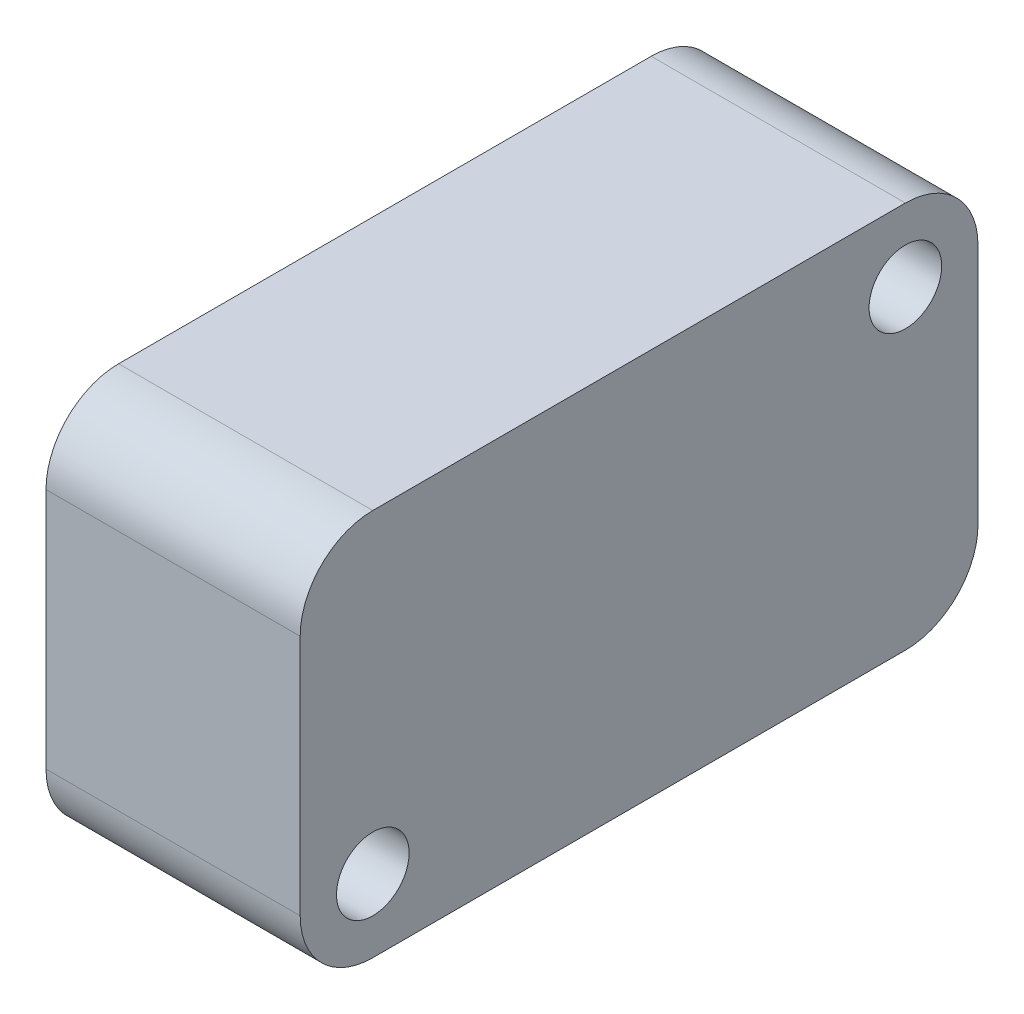
ISO-10303-21;
HEADER;
FILE_DESCRIPTION(('STEP AP214'),'2;1');
FILE_NAME('part.step','',(''),(''),'','','');
FILE_SCHEMA(('AUTOMOTIVE_DESIGN { 1 0 10303 214 1 1 1 1 }'));
ENDSEC;
DATA;
#1=APPLICATION_CONTEXT('core data for automotive mechanical design processes');
#2=APPLICATION_PROTOCOL_DEFINITION('international standard','automotive_design',2000,#1);
#3=PRODUCT_CONTEXT('',#1,'mechanical');
#4=PRODUCT('Part','Part','',(#3));
#5=PRODUCT_RELATED_PRODUCT_CATEGORY('part','',(#4));
#6=PRODUCT_DEFINITION_FORMATION('','',#4);
#7=PRODUCT_DEFINITION_CONTEXT('part definition',#1,'design');
#8=PRODUCT_DEFINITION('design','',#6,#7);
#9=PRODUCT_DEFINITION_SHAPE('','',#8);
#10=(LENGTH_UNIT() NAMED_UNIT(*) SI_UNIT(.MILLI.,.METRE.));
#11=(NAMED_UNIT(*) PLANE_ANGLE_UNIT() SI_UNIT($,.RADIAN.));
#12=(NAMED_UNIT(*) SI_UNIT($,.STERADIAN.) SOLID_ANGLE_UNIT());
#13=UNCERTAINTY_MEASURE_WITH_UNIT(LENGTH_MEASURE(1.E-05),#10,'distance_accuracy_value','');
#14=(GEOMETRIC_REPRESENTATION_CONTEXT(3) GLOBAL_UNCERTAINTY_ASSIGNED_CONTEXT((#13)) GLOBAL_UNIT_ASSIGNED_CONTEXT((#10,
#11,#12)) REPRESENTATION_CONTEXT('',''));
#15=CARTESIAN_POINT('',(0.,0.,0.));
#16=DIRECTION('',(0.,0.,1.));
#17=DIRECTION('',(1.,0.,0.));
#18=AXIS2_PLACEMENT_3D('',#15,#16,#17);
#19=CARTESIAN_POINT('',(10.5,-8.,14.));
#20=DIRECTION('',(0.,1.,0.));
#21=DIRECTION('',(0.,0.,1.));
#22=AXIS2_PLACEMENT_3D('',#19,#20,#21);
#23=PLANE('',#22);
#24=DIRECTION('',(0.,0.,-1.));
#25=VECTOR('',#24,1.);
#26=CARTESIAN_POINT('',(0.,-8.,14.));
#27=LINE('',#26,#25);
#28=CARTESIAN_POINT('',(0.,-8.,11.));
#29=VERTEX_POINT('',#28);
#30=CARTESIAN_POINT('',(0.,-8.,-11.));
#31=VERTEX_POINT('',#30);
#32=EDGE_CURVE('E183',#29,#31,#27,.T.);
#33=ORIENTED_EDGE('',*,*,#32,.T.);
#34=DIRECTION('',(-1.,0.,0.));
#35=VECTOR('',#34,1.);
#36=CARTESIAN_POINT('',(10.5,-8.,-11.));
#37=LINE('',#36,#35);
#38=CARTESIAN_POINT('',(10.5,-8.,-11.));
#39=VERTEX_POINT('',#38);
#40=EDGE_CURVE('E218',#31,#39,#37,.F.);
#41=ORIENTED_EDGE('',*,*,#40,.T.);
#42=DIRECTION('',(0.,0.,-1.));
#43=VECTOR('',#42,1.);
#44=CARTESIAN_POINT('',(10.5,-8.,14.));
#45=LINE('',#44,#43);
#46=CARTESIAN_POINT('',(10.5,-8.,11.));
#47=VERTEX_POINT('',#46);
#48=EDGE_CURVE('E189',#47,#39,#45,.T.);
#49=ORIENTED_EDGE('',*,*,#48,.F.);
#50=DIRECTION('',(-1.,0.,0.));
#51=VECTOR('',#50,1.);
#52=CARTESIAN_POINT('',(10.5,-8.,11.));
#53=LINE('',#52,#51);
#54=EDGE_CURVE('E215',#47,#29,#53,.T.);
#55=ORIENTED_EDGE('',*,*,#54,.T.);
#56=EDGE_LOOP('',(#33,#41,#49,#55));
#57=FACE_BOUND('',#56,.T.);
#58=DIRECTION('',(0.,0.,-1.));
#59=VECTOR('',#58,1.);
#60=CARTESIAN_POINT('',(3.,-8.,-8.));
#61=LINE('',#60,#59);
#62=CARTESIAN_POINT('',(3.,-8.,-8.));
#63=VERTEX_POINT('',#62);
#64=CARTESIAN_POINT('',(3.,-8.,-10.5));
#65=VERTEX_POINT('',#64);
#66=EDGE_CURVE('E135',#63,#65,#61,.T.);
#67=ORIENTED_EDGE('',*,*,#66,.F.);
#68=DIRECTION('',(-1.,0.,0.));
#69=VECTOR('',#68,1.);
#70=CARTESIAN_POINT('',(3.,-8.,-8.));
#71=LINE('',#70,#69);
#72=CARTESIAN_POINT('',(7.5,-8.,-8.));
#73=VERTEX_POINT('',#72);
#74=EDGE_CURVE('E146',#73,#63,#71,.T.);
#75=ORIENTED_EDGE('',*,*,#74,.F.);
#76=DIRECTION('',(0.,0.,1.));
#77=VECTOR('',#76,1.);
#78=CARTESIAN_POINT('',(7.5,-8.,-8.));
#79=LINE('',#78,#77);
#80=CARTESIAN_POINT('',(7.5,-8.,-10.5));
#81=VERTEX_POINT('',#80);
#82=EDGE_CURVE('E154',#81,#73,#79,.T.);
#83=ORIENTED_EDGE('',*,*,#82,.F.);
#84=DIRECTION('',(1.,0.,0.));
#85=VECTOR('',#84,1.);
#86=CARTESIAN_POINT('',(3.,-8.,-10.5));
#87=LINE('',#86,#85);
#88=EDGE_CURVE('E149',#65,#81,#87,.T.);
#89=ORIENTED_EDGE('',*,*,#88,.F.);
#90=EDGE_LOOP('',(#67,#75,#83,#89));
#91=FACE_BOUND('',#90,.T.);
#92=ADVANCED_FACE('F33',(#57,#91),#23,.F.);
#93=CARTESIAN_POINT('',(10.5,8.,-14.));
#94=DIRECTION('',(0.,0.,1.));
#95=DIRECTION('',(0.,-1.,0.));
#96=AXIS2_PLACEMENT_3D('',#93,#94,#95);
#97=PLANE('',#96);
#98=DIRECTION('',(0.,1.,0.));
#99=VECTOR('',#98,1.);
#100=CARTESIAN_POINT('',(10.5,8.,-14.));
#101=LINE('',#100,#99);
#102=CARTESIAN_POINT('',(10.5,-5.,-14.));
#103=VERTEX_POINT('',#102);
#104=CARTESIAN_POINT('',(10.5,5.,-14.));
#105=VERTEX_POINT('',#104);
#106=EDGE_CURVE('E179',#103,#105,#101,.T.);
#107=ORIENTED_EDGE('',*,*,#106,.F.);
#108=DIRECTION('',(-1.,0.,0.));
#109=VECTOR('',#108,1.);
#110=CARTESIAN_POINT('',(10.5,-5.,-14.));
#111=LINE('',#110,#109);
#112=CARTESIAN_POINT('',(0.,-5.,-14.));
#113=VERTEX_POINT('',#112);
#114=EDGE_CURVE('E204',#103,#113,#111,.T.);
#115=ORIENTED_EDGE('',*,*,#114,.T.);
#116=DIRECTION('',(0.,1.,0.));
#117=VECTOR('',#116,1.);
#118=CARTESIAN_POINT('',(0.,8.,-14.));
#119=LINE('',#118,#117);
#120=CARTESIAN_POINT('',(0.,5.,-14.));
#121=VERTEX_POINT('',#120);
#122=EDGE_CURVE('E176',#113,#121,#119,.T.);
#123=ORIENTED_EDGE('',*,*,#122,.T.);
#124=DIRECTION('',(-1.,0.,0.));
#125=VECTOR('',#124,1.);
#126=CARTESIAN_POINT('',(10.5,5.,-14.));
#127=LINE('',#126,#125);
#128=EDGE_CURVE('E192',#121,#105,#127,.F.);
#129=ORIENTED_EDGE('',*,*,#128,.T.);
#130=EDGE_LOOP('',(#107,#115,#123,#129));
#131=FACE_BOUND('',#130,.T.);
#132=ADVANCED_FACE('F269',(#131),#97,.F.);
#133=CARTESIAN_POINT('',(10.5,8.,14.));
#134=DIRECTION('',(0.,-1.,0.));
#135=DIRECTION('',(0.,0.,-1.));
#136=AXIS2_PLACEMENT_3D('',#133,#134,#135);
#137=PLANE('',#136);
#138=DIRECTION('',(0.,0.,1.));
#139=VECTOR('',#138,1.);
#140=CARTESIAN_POINT('',(10.5,8.,14.));
#141=LINE('',#140,#139);
#142=CARTESIAN_POINT('',(10.5,8.,-11.));
#143=VERTEX_POINT('',#142);
#144=CARTESIAN_POINT('',(10.5,8.,11.));
#145=VERTEX_POINT('',#144);
#146=EDGE_CURVE('E182',#143,#145,#141,.T.);
#147=ORIENTED_EDGE('',*,*,#146,.F.);
#148=DIRECTION('',(-1.,0.,0.));
#149=VECTOR('',#148,1.);
#150=CARTESIAN_POINT('',(10.5,8.,-11.));
#151=LINE('',#150,#149);
#152=CARTESIAN_POINT('',(0.,8.,-11.));
#153=VERTEX_POINT('',#152);
#154=EDGE_CURVE('E230',#143,#153,#151,.T.);
#155=ORIENTED_EDGE('',*,*,#154,.T.);
#156=DIRECTION('',(0.,0.,1.));
#157=VECTOR('',#156,1.);
#158=CARTESIAN_POINT('',(0.,8.,14.));
#159=LINE('',#158,#157);
#160=CARTESIAN_POINT('',(0.,8.,11.));
#161=VERTEX_POINT('',#160);
#162=EDGE_CURVE('E195',#153,#161,#159,.T.);
#163=ORIENTED_EDGE('',*,*,#162,.T.);
#164=DIRECTION('',(-1.,0.,0.));
#165=VECTOR('',#164,1.);
#166=CARTESIAN_POINT('',(10.5,8.,11.));
#167=LINE('',#166,#165);
#168=EDGE_CURVE('E228',#161,#145,#167,.F.);
#169=ORIENTED_EDGE('',*,*,#168,.T.);
#170=EDGE_LOOP('',(#147,#155,#163,#169));
#171=FACE_BOUND('',#170,.T.);
#172=ADVANCED_FACE('F275',(#171),#137,.F.);
#173=CARTESIAN_POINT('',(10.5,8.,14.));
#174=DIRECTION('',(0.,0.,-1.));
#175=DIRECTION('',(0.,1.,0.));
#176=AXIS2_PLACEMENT_3D('',#173,#174,#175);
#177=PLANE('',#176);
#178=DIRECTION('',(0.,-1.,0.));
#179=VECTOR('',#178,1.);
#180=CARTESIAN_POINT('',(10.5,8.,14.));
#181=LINE('',#180,#179);
#182=CARTESIAN_POINT('',(10.5,5.,14.));
#183=VERTEX_POINT('',#182);
#184=CARTESIAN_POINT('',(10.5,-5.,14.));
#185=VERTEX_POINT('',#184);
#186=EDGE_CURVE('E186',#183,#185,#181,.T.);
#187=ORIENTED_EDGE('',*,*,#186,.F.);
#188=DIRECTION('',(-1.,0.,0.));
#189=VECTOR('',#188,1.);
#190=CARTESIAN_POINT('',(10.5,5.,14.));
#191=LINE('',#190,#189);
#192=CARTESIAN_POINT('',(0.,5.,14.));
#193=VERTEX_POINT('',#192);
#194=EDGE_CURVE('E235',#183,#193,#191,.T.);
#195=ORIENTED_EDGE('',*,*,#194,.T.);
#196=DIRECTION('',(0.,-1.,0.));
#197=VECTOR('',#196,1.);
#198=CARTESIAN_POINT('',(0.,8.,14.));
#199=LINE('',#198,#197);
#200=CARTESIAN_POINT('',(0.,-5.,14.));
#201=VERTEX_POINT('',#200);
#202=EDGE_CURVE('E198',#193,#201,#199,.T.);
#203=ORIENTED_EDGE('',*,*,#202,.T.);
#204=DIRECTION('',(-1.,0.,0.));
#205=VECTOR('',#204,1.);
#206=CARTESIAN_POINT('',(10.5,-5.,14.));
#207=LINE('',#206,#205);
#208=EDGE_CURVE('E233',#201,#185,#207,.F.);
#209=ORIENTED_EDGE('',*,*,#208,.T.);
#210=EDGE_LOOP('',(#187,#195,#203,#209));
#211=FACE_BOUND('',#210,.T.);
#212=ADVANCED_FACE('F282',(#211),#177,.F.);
#213=CARTESIAN_POINT('',(10.5,0.,0.));
#214=DIRECTION('',(1.,0.,0.));
#215=DIRECTION('',(0.,0.,-1.));
#216=AXIS2_PLACEMENT_3D('',#213,#214,#215);
#217=PLANE('',#216);
#218=CARTESIAN_POINT('',(10.5,-5.,11.));
#219=DIRECTION('',(1.,0.,0.));
#220=DIRECTION('',(0.,0.,-1.));
#221=AXIS2_PLACEMENT_3D('',#218,#219,#220);
#222=CIRCLE('',#221,1.5);
#223=CARTESIAN_POINT('',(10.5,-5.,9.5));
#224=VERTEX_POINT('',#223);
#225=EDGE_CURVE('E166',#224,#224,#222,.T.);
#226=ORIENTED_EDGE('',*,*,#225,.F.);
#227=EDGE_LOOP('',(#226));
#228=FACE_BOUND('',#227,.T.);
#229=CARTESIAN_POINT('',(10.5,5.,-11.));
#230=DIRECTION('',(1.,0.,0.));
#231=DIRECTION('',(0.,0.,-1.));
#232=AXIS2_PLACEMENT_3D('',#229,#230,#231);
#233=CIRCLE('',#232,1.5);
#234=CARTESIAN_POINT('',(10.5,5.,-12.5));
#235=VERTEX_POINT('',#234);
#236=EDGE_CURVE('E170',#235,#235,#233,.T.);
#237=ORIENTED_EDGE('',*,*,#236,.F.);
#238=EDGE_LOOP('',(#237));
#239=FACE_BOUND('',#238,.T.);
#240=ORIENTED_EDGE('',*,*,#48,.T.);
#241=CARTESIAN_POINT('',(10.5,-5.,-11.));
#242=DIRECTION('',(1.,0.,0.));
#243=DIRECTION('',(0.,0.,-1.));
#244=AXIS2_PLACEMENT_3D('',#241,#242,#243);
#245=CIRCLE('',#244,3.);
#246=EDGE_CURVE('E226',#39,#103,#245,.T.);
#247=ORIENTED_EDGE('',*,*,#246,.T.);
#248=ORIENTED_EDGE('',*,*,#106,.T.);
#249=CARTESIAN_POINT('',(10.5,5.,-11.));
#250=DIRECTION('',(1.,0.,0.));
#251=DIRECTION('',(0.,0.,-1.));
#252=AXIS2_PLACEMENT_3D('',#249,#250,#251);
#253=CIRCLE('',#252,3.);
#254=EDGE_CURVE('E224',#105,#143,#253,.T.);
#255=ORIENTED_EDGE('',*,*,#254,.T.);
#256=ORIENTED_EDGE('',*,*,#146,.T.);
#257=CARTESIAN_POINT('',(10.5,5.,11.));
#258=DIRECTION('',(1.,0.,0.));
#259=DIRECTION('',(0.,0.,-1.));
#260=AXIS2_PLACEMENT_3D('',#257,#258,#259);
#261=CIRCLE('',#260,3.);
#262=EDGE_CURVE('E222',#145,#183,#261,.T.);
#263=ORIENTED_EDGE('',*,*,#262,.T.);
#264=ORIENTED_EDGE('',*,*,#186,.T.);
#265=CARTESIAN_POINT('',(10.5,-5.,11.));
#266=DIRECTION('',(1.,0.,0.));
#267=DIRECTION('',(0.,0.,-1.));
#268=AXIS2_PLACEMENT_3D('',#265,#266,#267);
#269=CIRCLE('',#268,3.);
#270=EDGE_CURVE('E220',#185,#47,#269,.T.);
#271=ORIENTED_EDGE('',*,*,#270,.T.);
#272=EDGE_LOOP('',(#240,#247,#248,#255,#256,#263,#264,#271));
#273=FACE_BOUND('',#272,.T.);
#274=ADVANCED_FACE('F285',(#228,#239,#273),#217,.T.);
#275=CARTESIAN_POINT('',(0.,0.,0.));
#276=DIRECTION('',(1.,0.,0.));
#277=DIRECTION('',(0.,0.,-1.));
#278=AXIS2_PLACEMENT_3D('',#275,#276,#277);
#279=PLANE('',#278);
#280=CARTESIAN_POINT('',(0.,-5.,11.));
#281=DIRECTION('',(1.,0.,0.));
#282=DIRECTION('',(0.,0.,-1.));
#283=AXIS2_PLACEMENT_3D('',#280,#281,#282);
#284=CIRCLE('',#283,1.5);
#285=CARTESIAN_POINT('',(0.,-5.,9.5));
#286=VERTEX_POINT('',#285);
#287=EDGE_CURVE('E167',#286,#286,#284,.T.);
#288=ORIENTED_EDGE('',*,*,#287,.T.);
#289=EDGE_LOOP('',(#288));
#290=FACE_BOUND('',#289,.T.);
#291=CARTESIAN_POINT('',(0.,5.,-11.));
#292=DIRECTION('',(1.,0.,0.));
#293=DIRECTION('',(0.,0.,-1.));
#294=AXIS2_PLACEMENT_3D('',#291,#292,#293);
#295=CIRCLE('',#294,1.5);
#296=CARTESIAN_POINT('',(0.,5.,-12.5));
#297=VERTEX_POINT('',#296);
#298=EDGE_CURVE('E173',#297,#297,#295,.T.);
#299=ORIENTED_EDGE('',*,*,#298,.T.);
#300=EDGE_LOOP('',(#299));
#301=FACE_BOUND('',#300,.T.);
#302=ORIENTED_EDGE('',*,*,#122,.F.);
#303=CARTESIAN_POINT('',(0.,-5.,-11.));
#304=DIRECTION('',(1.,0.,0.));
#305=DIRECTION('',(0.,0.,-1.));
#306=AXIS2_PLACEMENT_3D('',#303,#304,#305);
#307=CIRCLE('',#306,3.);
#308=EDGE_CURVE('E213',#113,#31,#307,.F.);
#309=ORIENTED_EDGE('',*,*,#308,.T.);
#310=ORIENTED_EDGE('',*,*,#32,.F.);
#311=CARTESIAN_POINT('',(0.,-5.,11.));
#312=DIRECTION('',(1.,0.,0.));
#313=DIRECTION('',(0.,0.,-1.));
#314=AXIS2_PLACEMENT_3D('',#311,#312,#313);
#315=CIRCLE('',#314,3.);
#316=EDGE_CURVE('E207',#29,#201,#315,.F.);
#317=ORIENTED_EDGE('',*,*,#316,.T.);
#318=ORIENTED_EDGE('',*,*,#202,.F.);
#319=CARTESIAN_POINT('',(0.,5.,11.));
#320=DIRECTION('',(1.,0.,0.));
#321=DIRECTION('',(0.,0.,-1.));
#322=AXIS2_PLACEMENT_3D('',#319,#320,#321);
#323=CIRCLE('',#322,3.);
#324=EDGE_CURVE('E209',#193,#161,#323,.F.);
#325=ORIENTED_EDGE('',*,*,#324,.T.);
#326=ORIENTED_EDGE('',*,*,#162,.F.);
#327=CARTESIAN_POINT('',(0.,5.,-11.));
#328=DIRECTION('',(1.,0.,0.));
#329=DIRECTION('',(0.,0.,-1.));
#330=AXIS2_PLACEMENT_3D('',#327,#328,#329);
#331=CIRCLE('',#330,3.);
#332=EDGE_CURVE('E211',#153,#121,#331,.F.);
#333=ORIENTED_EDGE('',*,*,#332,.T.);
#334=EDGE_LOOP('',(#302,#309,#310,#317,#318,#325,#326,#333));
#335=FACE_BOUND('',#334,.T.);
#336=ADVANCED_FACE('F280',(#290,#301,#335),#279,.F.);
#337=CARTESIAN_POINT('',(0.,5.,-11.));
#338=DIRECTION('',(1.,0.,0.));
#339=DIRECTION('',(0.,0.,-1.));
#340=AXIS2_PLACEMENT_3D('',#337,#338,#339);
#341=CYLINDRICAL_SURFACE('',#340,1.5);
#342=CARTESIAN_POINT('',(0.,5.,-12.5));
#343=CARTESIAN_POINT('',(0.109375,5.,-12.5));
#344=CARTESIAN_POINT('',(0.21875,5.,-12.5));
#345=CARTESIAN_POINT('',(0.4375,5.,-12.5));
#346=CARTESIAN_POINT('',(0.546875,5.,-12.5));
#347=CARTESIAN_POINT('',(0.765625,5.,-12.5));
#348=CARTESIAN_POINT('',(0.875,5.,-12.5));
#349=CARTESIAN_POINT('',(1.09375,5.,-12.5));
#350=CARTESIAN_POINT('',(1.203125,5.,-12.5));
#351=CARTESIAN_POINT('',(1.421875,5.,-12.5));
#352=CARTESIAN_POINT('',(1.53125,5.,-12.5));
#353=CARTESIAN_POINT('',(1.75,5.,-12.5));
#354=CARTESIAN_POINT('',(1.859375,5.,-12.5));
#355=CARTESIAN_POINT('',(2.078125,5.,-12.5));
#356=CARTESIAN_POINT('',(2.1875,5.,-12.5));
#357=CARTESIAN_POINT('',(2.40625,5.,-12.5));
#358=CARTESIAN_POINT('',(2.515625,5.,-12.5));
#359=CARTESIAN_POINT('',(2.734375,5.,-12.5));
#360=CARTESIAN_POINT('',(2.84375,5.,-12.5));
#361=CARTESIAN_POINT('',(3.0625,5.,-12.5));
#362=CARTESIAN_POINT('',(3.171875,5.,-12.5));
#363=CARTESIAN_POINT('',(3.390625,5.,-12.5));
#364=CARTESIAN_POINT('',(3.5,5.,-12.5));
#365=CARTESIAN_POINT('',(3.71875,5.,-12.5));
#366=CARTESIAN_POINT('',(3.828125,5.,-12.5));
#367=CARTESIAN_POINT('',(4.046875,5.,-12.5));
#368=CARTESIAN_POINT('',(4.15625,5.,-12.5));
#369=CARTESIAN_POINT('',(4.375,5.,-12.5));
#370=CARTESIAN_POINT('',(4.484375,5.,-12.5));
#371=CARTESIAN_POINT('',(4.703125,5.,-12.5));
#372=CARTESIAN_POINT('',(4.8125,5.,-12.5));
#373=CARTESIAN_POINT('',(5.03125,5.,-12.5));
#374=CARTESIAN_POINT('',(5.140625,5.,-12.5));
#375=CARTESIAN_POINT('',(5.359375,5.,-12.5));
#376=CARTESIAN_POINT('',(5.46875,5.,-12.5));
#377=CARTESIAN_POINT('',(5.6875,5.,-12.5));
#378=CARTESIAN_POINT('',(5.796875,5.,-12.5));
#379=CARTESIAN_POINT('',(6.015625,5.,-12.5));
#380=CARTESIAN_POINT('',(6.125,5.,-12.5));
#381=CARTESIAN_POINT('',(6.34375,5.,-12.5));
#382=CARTESIAN_POINT('',(6.453125,5.,-12.5));
#383=CARTESIAN_POINT('',(6.671875,5.,-12.5));
#384=CARTESIAN_POINT('',(6.78125,5.,-12.5));
#385=CARTESIAN_POINT('',(7.,5.,-12.5));
#386=CARTESIAN_POINT('',(7.109375,5.,-12.5));
#387=CARTESIAN_POINT('',(7.328125,5.,-12.5));
#388=CARTESIAN_POINT('',(7.4375,5.,-12.5));
#389=CARTESIAN_POINT('',(7.65625,5.,-12.5));
#390=CARTESIAN_POINT('',(7.765625,5.,-12.5));
#391=CARTESIAN_POINT('',(7.984375,5.,-12.5));
#392=CARTESIAN_POINT('',(8.09375,5.,-12.5));
#393=CARTESIAN_POINT('',(8.3125,5.,-12.5));
#394=CARTESIAN_POINT('',(8.421875,5.,-12.5));
#395=CARTESIAN_POINT('',(8.640625,5.,-12.5));
#396=CARTESIAN_POINT('',(8.75,5.,-12.5));
#397=CARTESIAN_POINT('',(8.96875,5.,-12.5));
#398=CARTESIAN_POINT('',(9.078125,5.,-12.5));
#399=CARTESIAN_POINT('',(9.296875,5.,-12.5));
#400=CARTESIAN_POINT('',(9.40625,5.,-12.5));
#401=CARTESIAN_POINT('',(9.625,5.,-12.5));
#402=CARTESIAN_POINT('',(9.734375,5.,-12.5));
#403=CARTESIAN_POINT('',(9.953125,5.,-12.5));
#404=CARTESIAN_POINT('',(10.0625,5.,-12.5));
#405=CARTESIAN_POINT('',(10.28125,5.,-12.5));
#406=CARTESIAN_POINT('',(10.390625,5.,-12.5));
#407=CARTESIAN_POINT('',(10.5,5.,-12.5));
#408=B_SPLINE_CURVE_WITH_KNOTS('',3,(#342,#343,#344,#345,#346,#347,#348,#349,#350,#351,#352,
#353,#354,#355,#356,#357,#358,#359,#360,#361,#362,#363,#364,#365,#366,#367,#368,#369,#370,#371,
#372,#373,#374,#375,#376,#377,#378,#379,#380,#381,#382,#383,#384,#385,#386,#387,#388,#389,#390,
#391,#392,#393,#394,#395,#396,#397,#398,#399,#400,#401,#402,#403,#404,#405,#406,#407),
.UNSPECIFIED.,.F.,.F.,(4,2,2,2,2,2,2,2,2,2,2,2,2,2,2,2,2,2,2,2,2,2,2,2,2,2,2,2,2,2,2,2,4),(0.,
0.328125,0.65625,0.984375,1.3125,1.640625,1.96875,2.296875,2.625,2.953125,3.28125,3.609375,
3.9375,4.265625,4.59375,4.921875,5.25,5.578125,5.90625,6.234375,6.5625,6.890625,7.21875,
7.546875,7.875,8.203125,8.53125,8.859375,9.1875,9.515625,9.84375,10.171875,10.5),.UNSPECIFIED.);
#409=EDGE_CURVE('BSEAM333',#297,#235,#408,.T.);
#410=ORIENTED_EDGE('',*,*,#298,.F.);
#411=ORIENTED_EDGE('',*,*,#236,.T.);
#412=ORIENTED_EDGE('',*,*,#409,.T.);
#413=ORIENTED_EDGE('',*,*,#409,.F.);
#414=EDGE_LOOP('',(#410,#412,#411,#413));
#415=FACE_BOUND('',#414,.T.);
#416=ADVANCED_FACE('F333',(#415),#341,.F.);
#417=CARTESIAN_POINT('',(0.,-5.,11.));
#418=DIRECTION('',(1.,0.,0.));
#419=DIRECTION('',(0.,0.,-1.));
#420=AXIS2_PLACEMENT_3D('',#417,#418,#419);
#421=CYLINDRICAL_SURFACE('',#420,1.5);
#422=CARTESIAN_POINT('',(0.,-5.,9.5));
#423=CARTESIAN_POINT('',(0.109375,-5.,9.5));
#424=CARTESIAN_POINT('',(0.21875,-5.,9.5));
#425=CARTESIAN_POINT('',(0.4375,-5.,9.5));
#426=CARTESIAN_POINT('',(0.546875,-5.,9.5));
#427=CARTESIAN_POINT('',(0.765625,-5.,9.5));
#428=CARTESIAN_POINT('',(0.875,-5.,9.5));
#429=CARTESIAN_POINT('',(1.09375,-5.,9.5));
#430=CARTESIAN_POINT('',(1.203125,-5.,9.5));
#431=CARTESIAN_POINT('',(1.421875,-5.,9.5));
#432=CARTESIAN_POINT('',(1.53125,-5.,9.5));
#433=CARTESIAN_POINT('',(1.75,-5.,9.5));
#434=CARTESIAN_POINT('',(1.859375,-5.,9.5));
#435=CARTESIAN_POINT('',(2.078125,-5.,9.5));
#436=CARTESIAN_POINT('',(2.1875,-5.,9.5));
#437=CARTESIAN_POINT('',(2.40625,-5.,9.5));
#438=CARTESIAN_POINT('',(2.515625,-5.,9.5));
#439=CARTESIAN_POINT('',(2.734375,-5.,9.5));
#440=CARTESIAN_POINT('',(2.84375,-5.,9.5));
#441=CARTESIAN_POINT('',(3.0625,-5.,9.5));
#442=CARTESIAN_POINT('',(3.171875,-5.,9.5));
#443=CARTESIAN_POINT('',(3.390625,-5.,9.5));
#444=CARTESIAN_POINT('',(3.5,-5.,9.5));
#445=CARTESIAN_POINT('',(3.71875,-5.,9.5));
#446=CARTESIAN_POINT('',(3.828125,-5.,9.5));
#447=CARTESIAN_POINT('',(4.046875,-5.,9.5));
#448=CARTESIAN_POINT('',(4.15625,-5.,9.5));
#449=CARTESIAN_POINT('',(4.375,-5.,9.5));
#450=CARTESIAN_POINT('',(4.484375,-5.,9.5));
#451=CARTESIAN_POINT('',(4.703125,-5.,9.5));
#452=CARTESIAN_POINT('',(4.8125,-5.,9.5));
#453=CARTESIAN_POINT('',(5.03125,-5.,9.5));
#454=CARTESIAN_POINT('',(5.140625,-5.,9.5));
#455=CARTESIAN_POINT('',(5.359375,-5.,9.5));
#456=CARTESIAN_POINT('',(5.46875,-5.,9.5));
#457=CARTESIAN_POINT('',(5.6875,-5.,9.5));
#458=CARTESIAN_POINT('',(5.796875,-5.,9.5));
#459=CARTESIAN_POINT('',(6.015625,-5.,9.5));
#460=CARTESIAN_POINT('',(6.125,-5.,9.5));
#461=CARTESIAN_POINT('',(6.34375,-5.,9.5));
#462=CARTESIAN_POINT('',(6.453125,-5.,9.5));
#463=CARTESIAN_POINT('',(6.671875,-5.,9.5));
#464=CARTESIAN_POINT('',(6.78125,-5.,9.5));
#465=CARTESIAN_POINT('',(7.,-5.,9.5));
#466=CARTESIAN_POINT('',(7.109375,-5.,9.5));
#467=CARTESIAN_POINT('',(7.328125,-5.,9.5));
#468=CARTESIAN_POINT('',(7.4375,-5.,9.5));
#469=CARTESIAN_POINT('',(7.65625,-5.,9.5));
#470=CARTESIAN_POINT('',(7.765625,-5.,9.5));
#471=CARTESIAN_POINT('',(7.984375,-5.,9.5));
#472=CARTESIAN_POINT('',(8.09375,-5.,9.5));
#473=CARTESIAN_POINT('',(8.3125,-5.,9.5));
#474=CARTESIAN_POINT('',(8.421875,-5.,9.5));
#475=CARTESIAN_POINT('',(8.640625,-5.,9.5));
#476=CARTESIAN_POINT('',(8.75,-5.,9.5));
#477=CARTESIAN_POINT('',(8.96875,-5.,9.5));
#478=CARTESIAN_POINT('',(9.078125,-5.,9.5));
#479=CARTESIAN_POINT('',(9.296875,-5.,9.5));
#480=CARTESIAN_POINT('',(9.40625,-5.,9.5));
#481=CARTESIAN_POINT('',(9.625,-5.,9.5));
#482=CARTESIAN_POINT('',(9.734375,-5.,9.5));
#483=CARTESIAN_POINT('',(9.953125,-5.,9.5));
#484=CARTESIAN_POINT('',(10.0625,-5.,9.5));
#485=CARTESIAN_POINT('',(10.28125,-5.,9.5));
#486=CARTESIAN_POINT('',(10.390625,-5.,9.5));
#487=CARTESIAN_POINT('',(10.5,-5.,9.5));
#488=B_SPLINE_CURVE_WITH_KNOTS('',3,(#422,#423,#424,#425,#426,#427,#428,#429,#430,#431,#432,
#433,#434,#435,#436,#437,#438,#439,#440,#441,#442,#443,#444,#445,#446,#447,#448,#449,#450,#451,
#452,#453,#454,#455,#456,#457,#458,#459,#460,#461,#462,#463,#464,#465,#466,#467,#468,#469,#470,
#471,#472,#473,#474,#475,#476,#477,#478,#479,#480,#481,#482,#483,#484,#485,#486,#487),
.UNSPECIFIED.,.F.,.F.,(4,2,2,2,2,2,2,2,2,2,2,2,2,2,2,2,2,2,2,2,2,2,2,2,2,2,2,2,2,2,2,2,4),(0.,
0.328125,0.65625,0.984375,1.3125,1.640625,1.96875,2.296875,2.625,2.953125,3.28125,3.609375,
3.9375,4.265625,4.59375,4.921875,5.25,5.578125,5.90625,6.234375,6.5625,6.890625,7.21875,
7.546875,7.875,8.203125,8.53125,8.859375,9.1875,9.515625,9.84375,10.171875,10.5),.UNSPECIFIED.);
#489=EDGE_CURVE('BSEAM294',#286,#224,#488,.T.);
#490=ORIENTED_EDGE('',*,*,#287,.F.);
#491=ORIENTED_EDGE('',*,*,#225,.T.);
#492=ORIENTED_EDGE('',*,*,#489,.T.);
#493=ORIENTED_EDGE('',*,*,#489,.F.);
#494=EDGE_LOOP('',(#490,#492,#491,#493));
#495=FACE_BOUND('',#494,.T.);
#496=ADVANCED_FACE('F294',(#495),#421,.F.);
#497=CARTESIAN_POINT('',(10.5,-5.,-11.));
#498=DIRECTION('',(-1.,0.,0.));
#499=DIRECTION('',(0.,0.,1.));
#500=AXIS2_PLACEMENT_3D('',#497,#498,#499);
#501=CYLINDRICAL_SURFACE('',#500,3.);
#502=ORIENTED_EDGE('',*,*,#246,.F.);
#503=ORIENTED_EDGE('',*,*,#40,.F.);
#504=ORIENTED_EDGE('',*,*,#308,.F.);
#505=ORIENTED_EDGE('',*,*,#114,.F.);
#506=EDGE_LOOP('',(#502,#503,#504,#505));
#507=FACE_BOUND('',#506,.T.);
#508=ADVANCED_FACE('F290',(#507),#501,.T.);
#509=CARTESIAN_POINT('',(10.5,5.,-11.));
#510=DIRECTION('',(-1.,0.,0.));
#511=DIRECTION('',(0.,0.,1.));
#512=AXIS2_PLACEMENT_3D('',#509,#510,#511);
#513=CYLINDRICAL_SURFACE('',#512,3.);
#514=ORIENTED_EDGE('',*,*,#254,.F.);
#515=ORIENTED_EDGE('',*,*,#128,.F.);
#516=ORIENTED_EDGE('',*,*,#332,.F.);
#517=ORIENTED_EDGE('',*,*,#154,.F.);
#518=EDGE_LOOP('',(#514,#515,#516,#517));
#519=FACE_BOUND('',#518,.T.);
#520=ADVANCED_FACE('F293',(#519),#513,.T.);
#521=CARTESIAN_POINT('',(10.5,5.,11.));
#522=DIRECTION('',(-1.,0.,0.));
#523=DIRECTION('',(0.,0.,1.));
#524=AXIS2_PLACEMENT_3D('',#521,#522,#523);
#525=CYLINDRICAL_SURFACE('',#524,3.);
#526=ORIENTED_EDGE('',*,*,#262,.F.);
#527=ORIENTED_EDGE('',*,*,#168,.F.);
#528=ORIENTED_EDGE('',*,*,#324,.F.);
#529=ORIENTED_EDGE('',*,*,#194,.F.);
#530=EDGE_LOOP('',(#526,#527,#528,#529));
#531=FACE_BOUND('',#530,.T.);
#532=ADVANCED_FACE('F298',(#531),#525,.T.);
#533=CARTESIAN_POINT('',(10.5,-5.,11.));
#534=DIRECTION('',(-1.,0.,0.));
#535=DIRECTION('',(0.,0.,1.));
#536=AXIS2_PLACEMENT_3D('',#533,#534,#535);
#537=CYLINDRICAL_SURFACE('',#536,3.);
#538=ORIENTED_EDGE('',*,*,#270,.F.);
#539=ORIENTED_EDGE('',*,*,#208,.F.);
#540=ORIENTED_EDGE('',*,*,#316,.F.);
#541=ORIENTED_EDGE('',*,*,#54,.F.);
#542=EDGE_LOOP('',(#538,#539,#540,#541));
#543=FACE_BOUND('',#542,.T.);
#544=ADVANCED_FACE('F302',(#543),#537,.T.);
#545=CARTESIAN_POINT('',(3.,-10.5,-8.));
#546=DIRECTION('',(1.,0.,0.));
#547=DIRECTION('',(0.,0.,-1.));
#548=AXIS2_PLACEMENT_3D('',#545,#546,#547);
#549=PLANE('',#548);
#550=DIRECTION('',(0.,1.,0.));
#551=VECTOR('',#550,1.);
#552=CARTESIAN_POINT('',(3.,-10.5,-10.5));
#553=LINE('',#552,#551);
#554=CARTESIAN_POINT('',(3.,-10.,-10.5));
#555=VERTEX_POINT('',#554);
#556=EDGE_CURVE('E164',#555,#65,#553,.T.);
#557=ORIENTED_EDGE('',*,*,#556,.F.);
#558=CARTESIAN_POINT('',(3.,-10.,-10.));
#559=DIRECTION('',(1.,0.,0.));
#560=DIRECTION('',(0.,0.,-1.));
#561=AXIS2_PLACEMENT_3D('',#558,#559,#560);
#562=CIRCLE('',#561,0.5);
#563=CARTESIAN_POINT('',(3.,-10.5,-10.));
#564=VERTEX_POINT('',#563);
#565=EDGE_CURVE('E41',#555,#564,#562,.F.);
#566=ORIENTED_EDGE('',*,*,#565,.T.);
#567=DIRECTION('',(0.,0.,-1.));
#568=VECTOR('',#567,1.);
#569=CARTESIAN_POINT('',(3.,-10.5,-8.));
#570=LINE('',#569,#568);
#571=CARTESIAN_POINT('',(3.,-10.5,-8.5));
#572=VERTEX_POINT('',#571);
#573=EDGE_CURVE('E153',#572,#564,#570,.T.);
#574=ORIENTED_EDGE('',*,*,#573,.F.);
#575=CARTESIAN_POINT('',(3.,-10.,-8.5));
#576=DIRECTION('',(1.,0.,0.));
#577=DIRECTION('',(0.,0.,-1.));
#578=AXIS2_PLACEMENT_3D('',#575,#576,#577);
#579=CIRCLE('',#578,0.5);
#580=CARTESIAN_POINT('',(3.,-10.,-8.));
#581=VERTEX_POINT('',#580);
#582=EDGE_CURVE('E48',#572,#581,#579,.F.);
#583=ORIENTED_EDGE('',*,*,#582,.T.);
#584=DIRECTION('',(0.,1.,0.));
#585=VECTOR('',#584,1.);
#586=CARTESIAN_POINT('',(3.,-10.5,-8.));
#587=LINE('',#586,#585);
#588=EDGE_CURVE('E132',#581,#63,#587,.T.);
#589=ORIENTED_EDGE('',*,*,#588,.T.);
#590=ORIENTED_EDGE('',*,*,#66,.T.);
#591=EDGE_LOOP('',(#557,#566,#574,#583,#589,#590));
#592=FACE_BOUND('',#591,.T.);
#593=ADVANCED_FACE('F134',(#592),#549,.F.);
#594=CARTESIAN_POINT('',(3.,-10.5,-10.5));
#595=DIRECTION('',(0.,0.,1.));
#596=DIRECTION('',(1.,0.,0.));
#597=AXIS2_PLACEMENT_3D('',#594,#595,#596);
#598=PLANE('',#597);
#599=DIRECTION('',(0.,1.,0.));
#600=VECTOR('',#599,1.);
#601=CARTESIAN_POINT('',(7.5,-10.5,-10.5));
#602=LINE('',#601,#600);
#603=CARTESIAN_POINT('',(7.5,-10.,-10.5));
#604=VERTEX_POINT('',#603);
#605=EDGE_CURVE('E162',#604,#81,#602,.T.);
#606=ORIENTED_EDGE('',*,*,#605,.F.);
#607=DIRECTION('',(1.,0.,0.));
#608=VECTOR('',#607,1.);
#609=CARTESIAN_POINT('',(3.,-10.,-10.5));
#610=LINE('',#609,#608);
#611=EDGE_CURVE('E56',#604,#555,#610,.F.);
#612=ORIENTED_EDGE('',*,*,#611,.T.);
#613=ORIENTED_EDGE('',*,*,#556,.T.);
#614=ORIENTED_EDGE('',*,*,#88,.T.);
#615=EDGE_LOOP('',(#606,#612,#613,#614));
#616=FACE_BOUND('',#615,.T.);
#617=ADVANCED_FACE('F260',(#616),#598,.F.);
#618=CARTESIAN_POINT('',(7.5,-10.5,-8.));
#619=DIRECTION('',(-1.,0.,0.));
#620=DIRECTION('',(0.,0.,1.));
#621=AXIS2_PLACEMENT_3D('',#618,#619,#620);
#622=PLANE('',#621);
#623=DIRECTION('',(0.,0.,1.));
#624=VECTOR('',#623,1.);
#625=CARTESIAN_POINT('',(7.5,-10.5,-8.));
#626=LINE('',#625,#624);
#627=CARTESIAN_POINT('',(7.5,-10.5,-10.));
#628=VERTEX_POINT('',#627);
#629=CARTESIAN_POINT('',(7.5,-10.5,-8.5));
#630=VERTEX_POINT('',#629);
#631=EDGE_CURVE('E140',#628,#630,#626,.T.);
#632=ORIENTED_EDGE('',*,*,#631,.F.);
#633=CARTESIAN_POINT('',(7.5,-10.,-10.));
#634=DIRECTION('',(-1.,0.,0.));
#635=DIRECTION('',(0.,0.,1.));
#636=AXIS2_PLACEMENT_3D('',#633,#634,#635);
#637=CIRCLE('',#636,0.5);
#638=EDGE_CURVE('E246',#628,#604,#637,.F.);
#639=ORIENTED_EDGE('',*,*,#638,.T.);
#640=ORIENTED_EDGE('',*,*,#605,.T.);
#641=ORIENTED_EDGE('',*,*,#82,.T.);
#642=DIRECTION('',(0.,1.,0.));
#643=VECTOR('',#642,1.);
#644=CARTESIAN_POINT('',(7.5,-10.5,-8.));
#645=LINE('',#644,#643);
#646=CARTESIAN_POINT('',(7.5,-10.,-8.));
#647=VERTEX_POINT('',#646);
#648=EDGE_CURVE('E139',#647,#73,#645,.T.);
#649=ORIENTED_EDGE('',*,*,#648,.F.);
#650=CARTESIAN_POINT('',(7.5,-10.,-8.5));
#651=DIRECTION('',(-1.,0.,0.));
#652=DIRECTION('',(0.,0.,1.));
#653=AXIS2_PLACEMENT_3D('',#650,#651,#652);
#654=CIRCLE('',#653,0.5);
#655=EDGE_CURVE('E244',#647,#630,#654,.F.);
#656=ORIENTED_EDGE('',*,*,#655,.T.);
#657=EDGE_LOOP('',(#632,#639,#640,#641,#649,#656));
#658=FACE_BOUND('',#657,.T.);
#659=ADVANCED_FACE('F259',(#658),#622,.F.);
#660=CARTESIAN_POINT('',(3.,-10.5,-8.));
#661=DIRECTION('',(0.,0.,-1.));
#662=DIRECTION('',(-1.,0.,0.));
#663=AXIS2_PLACEMENT_3D('',#660,#661,#662);
#664=PLANE('',#663);
#665=ORIENTED_EDGE('',*,*,#588,.F.);
#666=DIRECTION('',(-1.,0.,0.));
#667=VECTOR('',#666,1.);
#668=CARTESIAN_POINT('',(7.5,-10.,-8.));
#669=LINE('',#668,#667);
#670=EDGE_CURVE('E11',#581,#647,#669,.F.);
#671=ORIENTED_EDGE('',*,*,#670,.T.);
#672=ORIENTED_EDGE('',*,*,#648,.T.);
#673=ORIENTED_EDGE('',*,*,#74,.T.);
#674=EDGE_LOOP('',(#665,#671,#672,#673));
#675=FACE_BOUND('',#674,.T.);
#676=ADVANCED_FACE('F151',(#675),#664,.F.);
#677=CARTESIAN_POINT('',(0.,-10.5,0.));
#678=DIRECTION('',(0.,-1.,0.));
#679=DIRECTION('',(0.,0.,-1.));
#680=AXIS2_PLACEMENT_3D('',#677,#678,#679);
#681=PLANE('',#680);
#682=ORIENTED_EDGE('',*,*,#573,.T.);
#683=DIRECTION('',(1.,0.,0.));
#684=VECTOR('',#683,1.);
#685=CARTESIAN_POINT('',(7.5,-10.5,-10.));
#686=LINE('',#685,#684);
#687=EDGE_CURVE('E241',#564,#628,#686,.T.);
#688=ORIENTED_EDGE('',*,*,#687,.T.);
#689=ORIENTED_EDGE('',*,*,#631,.T.);
#690=DIRECTION('',(-1.,0.,0.));
#691=VECTOR('',#690,1.);
#692=CARTESIAN_POINT('',(3.,-10.5,-8.5));
#693=LINE('',#692,#691);
#694=EDGE_CURVE('E238',#630,#572,#693,.T.);
#695=ORIENTED_EDGE('',*,*,#694,.T.);
#696=EDGE_LOOP('',(#682,#688,#689,#695));
#697=FACE_BOUND('',#696,.T.);
#698=ADVANCED_FACE('F253',(#697),#681,.T.);
#699=CARTESIAN_POINT('',(0.,-10.,-10.));
#700=DIRECTION('',(-1.,0.,0.));
#701=DIRECTION('',(0.,0.,1.));
#702=AXIS2_PLACEMENT_3D('',#699,#700,#701);
#703=CYLINDRICAL_SURFACE('',#702,0.5);
#704=ORIENTED_EDGE('',*,*,#565,.F.);
#705=ORIENTED_EDGE('',*,*,#611,.F.);
#706=ORIENTED_EDGE('',*,*,#638,.F.);
#707=ORIENTED_EDGE('',*,*,#687,.F.);
#708=EDGE_LOOP('',(#704,#705,#706,#707));
#709=FACE_BOUND('',#708,.T.);
#710=ADVANCED_FACE('F257',(#709),#703,.T.);
#711=CARTESIAN_POINT('',(0.,-10.,-8.5));
#712=DIRECTION('',(1.,0.,0.));
#713=DIRECTION('',(0.,0.,-1.));
#714=AXIS2_PLACEMENT_3D('',#711,#712,#713);
#715=CYLINDRICAL_SURFACE('',#714,0.5);
#716=ORIENTED_EDGE('',*,*,#655,.F.);
#717=ORIENTED_EDGE('',*,*,#670,.F.);
#718=ORIENTED_EDGE('',*,*,#582,.F.);
#719=ORIENTED_EDGE('',*,*,#694,.F.);
#720=EDGE_LOOP('',(#716,#717,#718,#719));
#721=FACE_BOUND('',#720,.T.);
#722=ADVANCED_FACE('F35',(#721),#715,.T.);
#723=CLOSED_SHELL('',(#92,#132,#172,#212,#274,#336,#416,#496,#508,#520,#532,#544,#593,#617,#659,
#676,#698,#710,#722));
#724=MANIFOLD_SOLID_BREP('B2',#723);
#725=ADVANCED_BREP_SHAPE_REPRESENTATION('',(#18,#724),#14);
#726=SHAPE_DEFINITION_REPRESENTATION(#9,#725);
ENDSEC;
END-ISO-10303-21;
